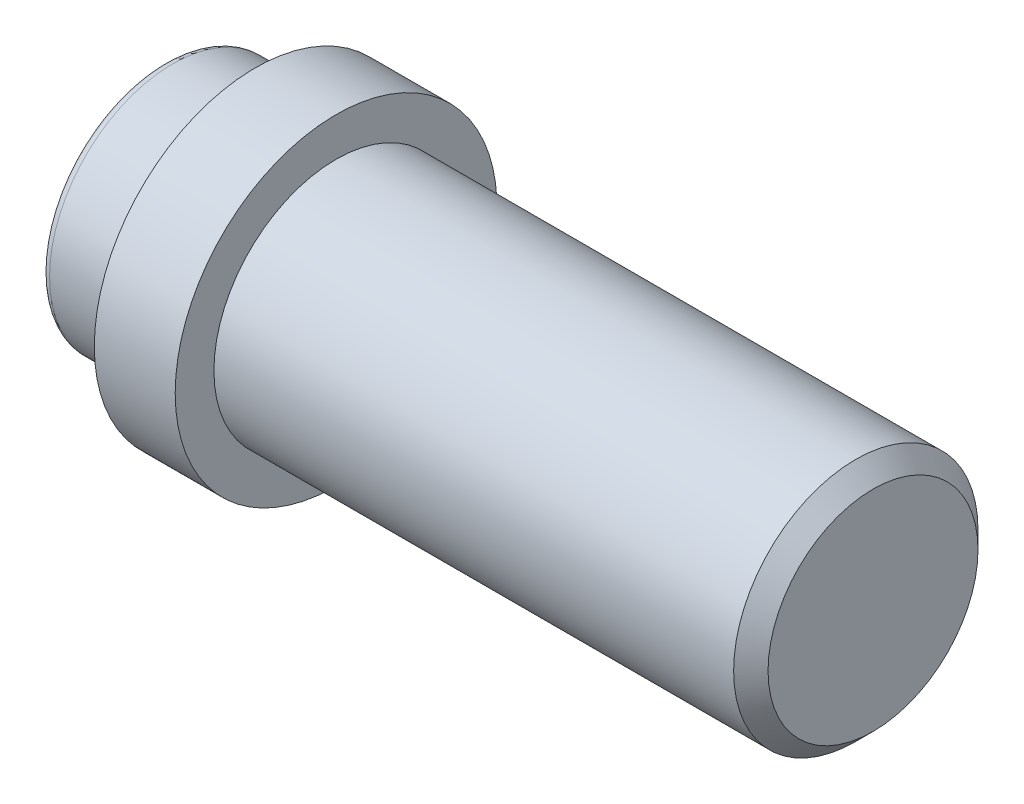
ISO-10303-21;
HEADER;
FILE_DESCRIPTION(('STEP AP214'),'2;1');
FILE_NAME('part.step','',(''),(''),'','','');
FILE_SCHEMA(('AUTOMOTIVE_DESIGN { 1 0 10303 214 1 1 1 1 }'));
ENDSEC;
DATA;
#1=APPLICATION_CONTEXT('core data for automotive mechanical design processes');
#2=APPLICATION_PROTOCOL_DEFINITION('international standard','automotive_design',2000,#1);
#3=PRODUCT_CONTEXT('',#1,'mechanical');
#4=PRODUCT('Part','Part','',(#3));
#5=PRODUCT_RELATED_PRODUCT_CATEGORY('part','',(#4));
#6=PRODUCT_DEFINITION_FORMATION('','',#4);
#7=PRODUCT_DEFINITION_CONTEXT('part definition',#1,'design');
#8=PRODUCT_DEFINITION('design','',#6,#7);
#9=PRODUCT_DEFINITION_SHAPE('','',#8);
#10=(LENGTH_UNIT() NAMED_UNIT(*) SI_UNIT(.MILLI.,.METRE.));
#11=(NAMED_UNIT(*) PLANE_ANGLE_UNIT() SI_UNIT($,.RADIAN.));
#12=(NAMED_UNIT(*) SI_UNIT($,.STERADIAN.) SOLID_ANGLE_UNIT());
#13=UNCERTAINTY_MEASURE_WITH_UNIT(LENGTH_MEASURE(1.E-05),#10,'distance_accuracy_value','');
#14=(GEOMETRIC_REPRESENTATION_CONTEXT(3) GLOBAL_UNCERTAINTY_ASSIGNED_CONTEXT((#13)) GLOBAL_UNIT_ASSIGNED_CONTEXT((#10,
#11,#12)) REPRESENTATION_CONTEXT('',''));
#15=CARTESIAN_POINT('',(0.,0.,0.));
#16=DIRECTION('',(0.,0.,1.));
#17=DIRECTION('',(1.,0.,0.));
#18=AXIS2_PLACEMENT_3D('',#15,#16,#17);
#19=CARTESIAN_POINT('',(0.12700000000003,0.,0.));
#20=DIRECTION('',(-1.,0.,0.));
#21=DIRECTION('',(0.,0.,1.));
#22=AXIS2_PLACEMENT_3D('',#19,#20,#21);
#23=TOROIDAL_SURFACE('',#22,1.68910000000003,0.126999999999988);
#24=CARTESIAN_POINT('',(0.,0.,0.));
#25=DIRECTION('',(-1.,0.,0.));
#26=DIRECTION('',(0.,0.,1.));
#27=AXIS2_PLACEMENT_3D('',#24,#25,#26);
#28=CIRCLE('',#27,1.68910000000003);
#29=CARTESIAN_POINT('',(0.,0.,1.68910000000003));
#30=VERTEX_POINT('',#29);
#31=EDGE_CURVE('E11',#30,#30,#28,.T.);
#32=ORIENTED_EDGE('',*,*,#31,.F.);
#33=EDGE_LOOP('',(#32));
#34=FACE_BOUND('',#33,.T.);
#35=CARTESIAN_POINT('',(0.12700000000003,0.,0.));
#36=DIRECTION('',(-1.,0.,0.));
#37=DIRECTION('',(0.,0.,1.));
#38=AXIS2_PLACEMENT_3D('',#35,#36,#37);
#39=CIRCLE('',#38,1.81610000000001);
#40=CARTESIAN_POINT('',(0.12700000000003,0.,1.81610000000001));
#41=VERTEX_POINT('',#40);
#42=EDGE_CURVE('E54',#41,#41,#39,.T.);
#43=ORIENTED_EDGE('',*,*,#42,.T.);
#44=EDGE_LOOP('',(#43));
#45=FACE_BOUND('',#44,.T.);
#46=ADVANCED_FACE('F35',(#34,#45),#23,.T.);
#47=CARTESIAN_POINT('',(0.,0.,0.));
#48=DIRECTION('',(1.,0.,0.));
#49=DIRECTION('',(0.,0.,-1.));
#50=AXIS2_PLACEMENT_3D('',#47,#48,#49);
#51=PLANE('',#50);
#52=CARTESIAN_POINT('',(0.,0.,0.));
#53=DIRECTION('',(-1.,0.,0.));
#54=DIRECTION('',(0.,0.,1.));
#55=AXIS2_PLACEMENT_3D('',#52,#53,#54);
#56=CIRCLE('',#55,1.4986);
#57=CARTESIAN_POINT('',(0.,0.,1.4986));
#58=VERTEX_POINT('',#57);
#59=EDGE_CURVE('E61',#58,#58,#56,.T.);
#60=ORIENTED_EDGE('',*,*,#59,.F.);
#61=EDGE_LOOP('',(#60));
#62=FACE_BOUND('',#61,.T.);
#63=ORIENTED_EDGE('',*,*,#31,.T.);
#64=EDGE_LOOP('',(#63));
#65=FACE_BOUND('',#64,.T.);
#66=ADVANCED_FACE('F85',(#62,#65),#51,.F.);
#67=CARTESIAN_POINT('',(10.4648000000001,1.5494,0.));
#68=DIRECTION('',(-1.,0.,0.));
#69=DIRECTION('',(0.,0.,1.));
#70=AXIS2_PLACEMENT_3D('',#67,#68,#69);
#71=PLANE('',#70);
#72=CARTESIAN_POINT('',(10.4648000000001,0.,0.));
#73=DIRECTION('',(-1.,0.,0.));
#74=DIRECTION('',(0.,0.,1.));
#75=AXIS2_PLACEMENT_3D('',#72,#73,#74);
#76=CIRCLE('',#75,1.5494);
#77=CARTESIAN_POINT('',(10.4648000000001,0.,1.5494));
#78=VERTEX_POINT('',#77);
#79=EDGE_CURVE('E41',#78,#78,#76,.T.);
#80=ORIENTED_EDGE('',*,*,#79,.F.);
#81=EDGE_LOOP('',(#80));
#82=FACE_BOUND('',#81,.T.);
#83=ADVANCED_FACE('F83',(#82),#71,.F.);
#84=CARTESIAN_POINT('',(10.4648000000001,0.,0.));
#85=DIRECTION('',(-1.,0.,0.));
#86=DIRECTION('',(0.,0.,1.));
#87=AXIS2_PLACEMENT_3D('',#84,#85,#86);
#88=CONICAL_SURFACE('',#87,1.5494,0.785398163397448);
#89=CARTESIAN_POINT('',(10.2108,0.,0.));
#90=DIRECTION('',(-1.,0.,0.));
#91=DIRECTION('',(0.,0.,1.));
#92=AXIS2_PLACEMENT_3D('',#89,#90,#91);
#93=CIRCLE('',#92,1.8034);
#94=CARTESIAN_POINT('',(10.2108,0.,1.8034));
#95=VERTEX_POINT('',#94);
#96=EDGE_CURVE('E76',#95,#95,#93,.T.);
#97=ORIENTED_EDGE('',*,*,#96,.F.);
#98=EDGE_LOOP('',(#97));
#99=FACE_BOUND('',#98,.T.);
#100=ORIENTED_EDGE('',*,*,#79,.T.);
#101=EDGE_LOOP('',(#100));
#102=FACE_BOUND('',#101,.T.);
#103=ADVANCED_FACE('F81',(#99,#102),#88,.T.);
#104=CARTESIAN_POINT('',(0.,0.,0.));
#105=DIRECTION('',(-1.,0.,0.));
#106=DIRECTION('',(0.,0.,1.));
#107=AXIS2_PLACEMENT_3D('',#104,#105,#106);
#108=CYLINDRICAL_SURFACE('',#107,1.8034);
#109=CARTESIAN_POINT('',(2.54000000000007,0.,0.));
#110=DIRECTION('',(-1.,0.,0.));
#111=DIRECTION('',(0.,0.,1.));
#112=AXIS2_PLACEMENT_3D('',#109,#110,#111);
#113=CIRCLE('',#112,1.8034);
#114=CARTESIAN_POINT('',(2.54000000000007,0.,1.8034));
#115=VERTEX_POINT('',#114);
#116=EDGE_CURVE('E73',#115,#115,#113,.T.);
#117=ORIENTED_EDGE('',*,*,#116,.F.);
#118=EDGE_LOOP('',(#117));
#119=FACE_BOUND('',#118,.T.);
#120=ORIENTED_EDGE('',*,*,#96,.T.);
#121=EDGE_LOOP('',(#120));
#122=FACE_BOUND('',#121,.T.);
#123=ADVANCED_FACE('F91',(#119,#122),#108,.T.);
#124=CARTESIAN_POINT('',(2.54000000000008,2.37490000000001,0.));
#125=DIRECTION('',(-1.,0.,0.));
#126=DIRECTION('',(0.,0.,1.));
#127=AXIS2_PLACEMENT_3D('',#124,#125,#126);
#128=PLANE('',#127);
#129=CARTESIAN_POINT('',(2.5400000000001,0.,0.));
#130=DIRECTION('',(-1.,0.,0.));
#131=DIRECTION('',(0.,0.,1.));
#132=AXIS2_PLACEMENT_3D('',#129,#130,#131);
#133=CIRCLE('',#132,2.37490000000001);
#134=CARTESIAN_POINT('',(2.5400000000001,0.,2.37490000000001));
#135=VERTEX_POINT('',#134);
#136=EDGE_CURVE('E70',#135,#135,#133,.T.);
#137=ORIENTED_EDGE('',*,*,#136,.F.);
#138=EDGE_LOOP('',(#137));
#139=FACE_BOUND('',#138,.T.);
#140=ORIENTED_EDGE('',*,*,#116,.T.);
#141=EDGE_LOOP('',(#140));
#142=FACE_BOUND('',#141,.T.);
#143=ADVANCED_FACE('F117',(#139,#142),#128,.F.);
#144=CARTESIAN_POINT('',(0.,0.,0.));
#145=DIRECTION('',(-1.,0.,0.));
#146=DIRECTION('',(0.,0.,1.));
#147=AXIS2_PLACEMENT_3D('',#144,#145,#146);
#148=CYLINDRICAL_SURFACE('',#147,2.37490000000001);
#149=CARTESIAN_POINT('',(1.34620000000016,0.,0.));
#150=DIRECTION('',(-1.,0.,0.));
#151=DIRECTION('',(0.,0.,1.));
#152=AXIS2_PLACEMENT_3D('',#149,#150,#151);
#153=CIRCLE('',#152,2.37490000000001);
#154=CARTESIAN_POINT('',(1.34620000000016,0.,2.37490000000001));
#155=VERTEX_POINT('',#154);
#156=EDGE_CURVE('E67',#155,#155,#153,.T.);
#157=ORIENTED_EDGE('',*,*,#156,.F.);
#158=EDGE_LOOP('',(#157));
#159=FACE_BOUND('',#158,.T.);
#160=ORIENTED_EDGE('',*,*,#136,.T.);
#161=EDGE_LOOP('',(#160));
#162=FACE_BOUND('',#161,.T.);
#163=ADVANCED_FACE('F111',(#159,#162),#148,.T.);
#164=CARTESIAN_POINT('',(1.34620000000016,1.81610000000001,0.));
#165=DIRECTION('',(1.,0.,0.));
#166=DIRECTION('',(0.,0.,-1.));
#167=AXIS2_PLACEMENT_3D('',#164,#165,#166);
#168=PLANE('',#167);
#169=CARTESIAN_POINT('',(1.34620000000016,0.,0.));
#170=DIRECTION('',(-1.,0.,0.));
#171=DIRECTION('',(0.,0.,1.));
#172=AXIS2_PLACEMENT_3D('',#169,#170,#171);
#173=CIRCLE('',#172,1.81610000000001);
#174=CARTESIAN_POINT('',(1.34620000000016,0.,1.81610000000001));
#175=VERTEX_POINT('',#174);
#176=EDGE_CURVE('E58',#175,#175,#173,.T.);
#177=ORIENTED_EDGE('',*,*,#176,.F.);
#178=EDGE_LOOP('',(#177));
#179=FACE_BOUND('',#178,.T.);
#180=ORIENTED_EDGE('',*,*,#156,.T.);
#181=EDGE_LOOP('',(#180));
#182=FACE_BOUND('',#181,.T.);
#183=ADVANCED_FACE('F105',(#179,#182),#168,.F.);
#184=CARTESIAN_POINT('',(0.,0.,0.));
#185=DIRECTION('',(-1.,0.,0.));
#186=DIRECTION('',(0.,0.,1.));
#187=AXIS2_PLACEMENT_3D('',#184,#185,#186);
#188=CYLINDRICAL_SURFACE('',#187,1.81610000000001);
#189=ORIENTED_EDGE('',*,*,#42,.F.);
#190=EDGE_LOOP('',(#189));
#191=FACE_BOUND('',#190,.T.);
#192=ORIENTED_EDGE('',*,*,#176,.T.);
#193=EDGE_LOOP('',(#192));
#194=FACE_BOUND('',#193,.T.);
#195=ADVANCED_FACE('F48',(#191,#194),#188,.T.);
#196=CARTESIAN_POINT('',(8.636,0.,0.));
#197=DIRECTION('',(-1.,0.,0.));
#198=DIRECTION('',(0.,0.,1.));
#199=AXIS2_PLACEMENT_3D('',#196,#197,#198);
#200=CONICAL_SURFACE('',#199,1.3589,1.02974425867666);
#201=CARTESIAN_POINT('',(9.45250949519655,0.,0.));
#202=VERTEX_POINT('',#201);
#203=VERTEX_LOOP('',#202);
#204=FACE_BOUND('',#203,.T.);
#205=CARTESIAN_POINT('',(8.636,0.,0.));
#206=DIRECTION('',(-1.,0.,0.));
#207=DIRECTION('',(0.,0.,1.));
#208=AXIS2_PLACEMENT_3D('',#205,#206,#207);
#209=CIRCLE('',#208,1.3589);
#210=CARTESIAN_POINT('',(8.636,0.,1.3589));
#211=VERTEX_POINT('',#210);
#212=EDGE_CURVE('E52',#211,#211,#209,.T.);
#213=ORIENTED_EDGE('',*,*,#212,.T.);
#214=EDGE_LOOP('',(#213));
#215=FACE_BOUND('',#214,.T.);
#216=ADVANCED_FACE('F44',(#204,#215),#200,.F.);
#217=CARTESIAN_POINT('',(0.,0.,0.));
#218=DIRECTION('',(-1.,0.,0.));
#219=DIRECTION('',(0.,0.,1.));
#220=AXIS2_PLACEMENT_3D('',#217,#218,#219);
#221=CYLINDRICAL_SURFACE('',#220,1.3589);
#222=ORIENTED_EDGE('',*,*,#212,.F.);
#223=EDGE_LOOP('',(#222));
#224=FACE_BOUND('',#223,.T.);
#225=CARTESIAN_POINT('',(0.241967497817359,0.,0.));
#226=DIRECTION('',(-1.,0.,0.));
#227=DIRECTION('',(0.,0.,1.));
#228=AXIS2_PLACEMENT_3D('',#225,#226,#227);
#229=CIRCLE('',#228,1.3589);
#230=CARTESIAN_POINT('',(0.241967497817359,0.,1.3589));
#231=VERTEX_POINT('',#230);
#232=EDGE_CURVE('E55',#231,#231,#229,.T.);
#233=ORIENTED_EDGE('',*,*,#232,.T.);
#234=EDGE_LOOP('',(#233));
#235=FACE_BOUND('',#234,.T.);
#236=ADVANCED_FACE('F47',(#224,#235),#221,.F.);
#237=CARTESIAN_POINT('',(0.,0.,0.));
#238=DIRECTION('',(-1.,0.,0.));
#239=DIRECTION('',(0.,0.,1.));
#240=AXIS2_PLACEMENT_3D('',#237,#238,#239);
#241=CONICAL_SURFACE('',#240,1.4986,0.523598775598312);
#242=ORIENTED_EDGE('',*,*,#232,.F.);
#243=EDGE_LOOP('',(#242));
#244=FACE_BOUND('',#243,.T.);
#245=ORIENTED_EDGE('',*,*,#59,.T.);
#246=EDGE_LOOP('',(#245));
#247=FACE_BOUND('',#246,.T.);
#248=ADVANCED_FACE('F135',(#244,#247),#241,.F.);
#249=CLOSED_SHELL('',(#46,#66,#83,#103,#123,#143,#163,#183,#195,#216,#236,#248));
#250=MANIFOLD_SOLID_BREP('B2',#249);
#251=ADVANCED_BREP_SHAPE_REPRESENTATION('',(#18,#250),#14);
#252=SHAPE_DEFINITION_REPRESENTATION(#9,#251);
ENDSEC;
END-ISO-10303-21;
